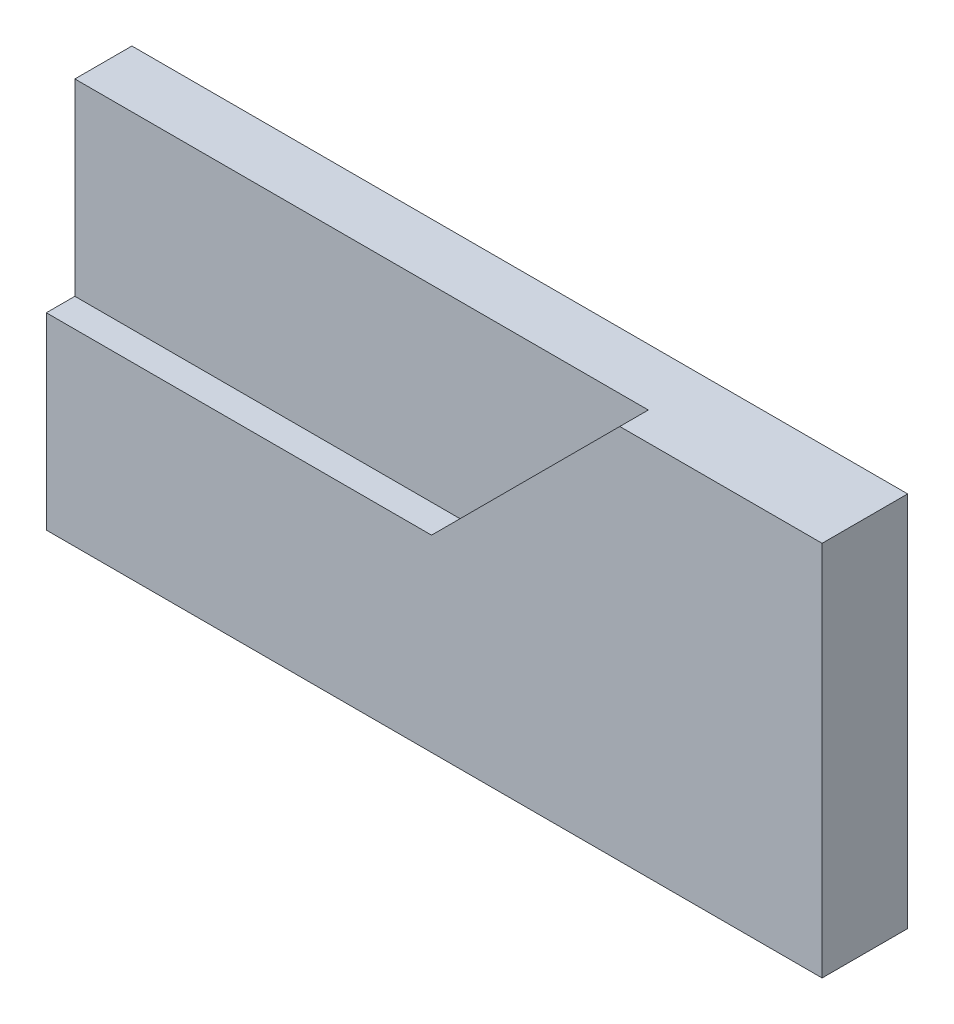
ISO-10303-21;
HEADER;
FILE_DESCRIPTION(('STEP AP214'),'2;1');
FILE_NAME('part.step','',(''),(''),'','','');
FILE_SCHEMA(('AUTOMOTIVE_DESIGN { 1 0 10303 214 1 1 1 1 }'));
ENDSEC;
DATA;
#1=APPLICATION_CONTEXT('core data for automotive mechanical design processes');
#2=APPLICATION_PROTOCOL_DEFINITION('international standard','automotive_design',2000,#1);
#3=PRODUCT_CONTEXT('',#1,'mechanical');
#4=PRODUCT('Part','Part','',(#3));
#5=PRODUCT_RELATED_PRODUCT_CATEGORY('part','',(#4));
#6=PRODUCT_DEFINITION_FORMATION('','',#4);
#7=PRODUCT_DEFINITION_CONTEXT('part definition',#1,'design');
#8=PRODUCT_DEFINITION('design','',#6,#7);
#9=PRODUCT_DEFINITION_SHAPE('','',#8);
#10=(LENGTH_UNIT() NAMED_UNIT(*) SI_UNIT(.MILLI.,.METRE.));
#11=(NAMED_UNIT(*) PLANE_ANGLE_UNIT() SI_UNIT($,.RADIAN.));
#12=(NAMED_UNIT(*) SI_UNIT($,.STERADIAN.) SOLID_ANGLE_UNIT());
#13=UNCERTAINTY_MEASURE_WITH_UNIT(LENGTH_MEASURE(1.E-05),#10,'distance_accuracy_value','');
#14=(GEOMETRIC_REPRESENTATION_CONTEXT(3) GLOBAL_UNCERTAINTY_ASSIGNED_CONTEXT((#13)) GLOBAL_UNIT_ASSIGNED_CONTEXT((#10,
#11,#12)) REPRESENTATION_CONTEXT('',''));
#15=CARTESIAN_POINT('',(0.,0.,0.));
#16=DIRECTION('',(0.,0.,1.));
#17=DIRECTION('',(1.,0.,0.));
#18=AXIS2_PLACEMENT_3D('',#15,#16,#17);
#19=CARTESIAN_POINT('',(20.1967772114493,31.337548907501,160.329908240271));
#20=DIRECTION('',(0.,-1.,0.));
#21=DIRECTION('',(0.,0.,-1.));
#22=AXIS2_PLACEMENT_3D('',#19,#20,#21);
#23=PLANE('',#22);
#24=DIRECTION('',(-1.,0.,0.));
#25=VECTOR('',#24,1.);
#26=CARTESIAN_POINT('',(16.6498722313358,31.337548907501,159.829908240271));
#27=LINE('',#26,#25);
#28=CARTESIAN_POINT('',(16.6498722313358,31.337548907501,159.829908240271));
#29=VERTEX_POINT('',#28);
#30=CARTESIAN_POINT('',(6.59677721144933,31.337548907501,159.829908240271));
#31=VERTEX_POINT('',#30);
#32=EDGE_CURVE('E113',#29,#31,#27,.T.);
#33=ORIENTED_EDGE('',*,*,#32,.F.);
#34=DIRECTION('',(0.,0.,1.));
#35=VECTOR('',#34,1.);
#36=CARTESIAN_POINT('',(16.6498722313358,31.337548907501,159.829908240271));
#37=LINE('',#36,#35);
#38=CARTESIAN_POINT('',(16.6498722313358,31.337548907501,160.329908240271));
#39=VERTEX_POINT('',#38);
#40=EDGE_CURVE('E120',#29,#39,#37,.T.);
#41=ORIENTED_EDGE('',*,*,#40,.T.);
#42=DIRECTION('',(-1.,0.,0.));
#43=VECTOR('',#42,1.);
#44=CARTESIAN_POINT('',(20.1967772114493,31.337548907501,160.329908240271));
#45=LINE('',#44,#43);
#46=CARTESIAN_POINT('',(20.1967772114493,31.337548907501,160.329908240271));
#47=VERTEX_POINT('',#46);
#48=EDGE_CURVE('E125',#47,#39,#45,.T.);
#49=ORIENTED_EDGE('',*,*,#48,.F.);
#50=DIRECTION('',(0.,0.,-1.));
#51=VECTOR('',#50,1.);
#52=CARTESIAN_POINT('',(20.1967772114493,31.337548907501,160.329908240271));
#53=LINE('',#52,#51);
#54=CARTESIAN_POINT('',(20.1967772114493,31.337548907501,158.829908240271));
#55=VERTEX_POINT('',#54);
#56=EDGE_CURVE('E131',#47,#55,#53,.T.);
#57=ORIENTED_EDGE('',*,*,#56,.T.);
#58=DIRECTION('',(-1.,0.,0.));
#59=VECTOR('',#58,1.);
#60=CARTESIAN_POINT('',(20.1967772114493,31.337548907501,158.829908240271));
#61=LINE('',#60,#59);
#62=CARTESIAN_POINT('',(6.59677721144933,31.337548907501,158.829908240271));
#63=VERTEX_POINT('',#62);
#64=EDGE_CURVE('E132',#55,#63,#61,.T.);
#65=ORIENTED_EDGE('',*,*,#64,.T.);
#66=DIRECTION('',(0.,0.,-1.));
#67=VECTOR('',#66,1.);
#68=CARTESIAN_POINT('',(6.59677721144933,31.337548907501,160.329908240271));
#69=LINE('',#68,#67);
#70=EDGE_CURVE('E11',#31,#63,#69,.T.);
#71=ORIENTED_EDGE('',*,*,#70,.F.);
#72=EDGE_LOOP('',(#33,#41,#49,#57,#65,#71));
#73=FACE_BOUND('',#72,.T.);
#74=ADVANCED_FACE('F35',(#73),#23,.F.);
#75=CARTESIAN_POINT('',(6.59677721144933,31.337548907501,160.329908240271));
#76=DIRECTION('',(1.,0.,0.));
#77=DIRECTION('',(0.,1.,0.));
#78=AXIS2_PLACEMENT_3D('',#75,#76,#77);
#79=PLANE('',#78);
#80=DIRECTION('',(0.,-1.,0.));
#81=VECTOR('',#80,1.);
#82=CARTESIAN_POINT('',(6.59677721144933,31.337548907501,160.329908240271));
#83=LINE('',#82,#81);
#84=CARTESIAN_POINT('',(6.59677721144933,28.037548907501,160.329908240271));
#85=VERTEX_POINT('',#84);
#86=CARTESIAN_POINT('',(6.59677721144933,24.737548907501,160.329908240271));
#87=VERTEX_POINT('',#86);
#88=EDGE_CURVE('E81',#85,#87,#83,.T.);
#89=ORIENTED_EDGE('',*,*,#88,.F.);
#90=DIRECTION('',(0.,0.,1.));
#91=VECTOR('',#90,1.);
#92=CARTESIAN_POINT('',(6.59677721144933,28.037548907501,159.829908240271));
#93=LINE('',#92,#91);
#94=CARTESIAN_POINT('',(6.59677721144933,28.037548907501,159.829908240271));
#95=VERTEX_POINT('',#94);
#96=EDGE_CURVE('E49',#95,#85,#93,.T.);
#97=ORIENTED_EDGE('',*,*,#96,.F.);
#98=DIRECTION('',(0.,-1.,0.));
#99=VECTOR('',#98,1.);
#100=CARTESIAN_POINT('',(6.59677721144933,31.337548907501,159.829908240271));
#101=LINE('',#100,#99);
#102=EDGE_CURVE('E108',#31,#95,#101,.T.);
#103=ORIENTED_EDGE('',*,*,#102,.F.);
#104=ORIENTED_EDGE('',*,*,#70,.T.);
#105=DIRECTION('',(0.,-1.,0.));
#106=VECTOR('',#105,1.);
#107=CARTESIAN_POINT('',(6.59677721144933,31.337548907501,158.829908240271));
#108=LINE('',#107,#106);
#109=CARTESIAN_POINT('',(6.59677721144933,24.737548907501,158.829908240271));
#110=VERTEX_POINT('',#109);
#111=EDGE_CURVE('E135',#63,#110,#108,.T.);
#112=ORIENTED_EDGE('',*,*,#111,.T.);
#113=DIRECTION('',(0.,0.,-1.));
#114=VECTOR('',#113,1.);
#115=CARTESIAN_POINT('',(6.59677721144933,24.737548907501,160.329908240271));
#116=LINE('',#115,#114);
#117=EDGE_CURVE('E42',#87,#110,#116,.T.);
#118=ORIENTED_EDGE('',*,*,#117,.F.);
#119=EDGE_LOOP('',(#89,#97,#103,#104,#112,#118));
#120=FACE_BOUND('',#119,.T.);
#121=ADVANCED_FACE('F118',(#120),#79,.F.);
#122=CARTESIAN_POINT('',(6.59677721144933,24.737548907501,160.329908240271));
#123=DIRECTION('',(0.,1.,0.));
#124=DIRECTION('',(0.,0.,1.));
#125=AXIS2_PLACEMENT_3D('',#122,#123,#124);
#126=PLANE('',#125);
#127=DIRECTION('',(1.,0.,0.));
#128=VECTOR('',#127,1.);
#129=CARTESIAN_POINT('',(6.59677721144933,24.737548907501,158.829908240271));
#130=LINE('',#129,#128);
#131=CARTESIAN_POINT('',(20.1967772114493,24.737548907501,158.829908240271));
#132=VERTEX_POINT('',#131);
#133=EDGE_CURVE('E137',#110,#132,#130,.T.);
#134=ORIENTED_EDGE('',*,*,#133,.T.);
#135=DIRECTION('',(0.,0.,-1.));
#136=VECTOR('',#135,1.);
#137=CARTESIAN_POINT('',(20.1967772114493,24.737548907501,160.329908240271));
#138=LINE('',#137,#136);
#139=CARTESIAN_POINT('',(20.1967772114493,24.737548907501,160.329908240271));
#140=VERTEX_POINT('',#139);
#141=EDGE_CURVE('E141',#140,#132,#138,.T.);
#142=ORIENTED_EDGE('',*,*,#141,.F.);
#143=DIRECTION('',(1.,0.,0.));
#144=VECTOR('',#143,1.);
#145=CARTESIAN_POINT('',(6.59677721144933,24.737548907501,160.329908240271));
#146=LINE('',#145,#144);
#147=EDGE_CURVE('E128',#87,#140,#146,.T.);
#148=ORIENTED_EDGE('',*,*,#147,.F.);
#149=ORIENTED_EDGE('',*,*,#117,.T.);
#150=EDGE_LOOP('',(#134,#142,#148,#149));
#151=FACE_BOUND('',#150,.T.);
#152=ADVANCED_FACE('F146',(#151),#126,.F.);
#153=CARTESIAN_POINT('',(20.1967772114493,24.737548907501,160.329908240271));
#154=DIRECTION('',(-1.,0.,0.));
#155=DIRECTION('',(0.,-1.,0.));
#156=AXIS2_PLACEMENT_3D('',#153,#154,#155);
#157=PLANE('',#156);
#158=DIRECTION('',(0.,1.,0.));
#159=VECTOR('',#158,1.);
#160=CARTESIAN_POINT('',(20.1967772114493,24.737548907501,158.829908240271));
#161=LINE('',#160,#159);
#162=EDGE_CURVE('E77',#132,#55,#161,.T.);
#163=ORIENTED_EDGE('',*,*,#162,.T.);
#164=ORIENTED_EDGE('',*,*,#56,.F.);
#165=DIRECTION('',(0.,1.,0.));
#166=VECTOR('',#165,1.);
#167=CARTESIAN_POINT('',(20.1967772114493,24.737548907501,160.329908240271));
#168=LINE('',#167,#166);
#169=EDGE_CURVE('E58',#140,#47,#168,.T.);
#170=ORIENTED_EDGE('',*,*,#169,.F.);
#171=ORIENTED_EDGE('',*,*,#141,.T.);
#172=EDGE_LOOP('',(#163,#164,#170,#171));
#173=FACE_BOUND('',#172,.T.);
#174=ADVANCED_FACE('F155',(#173),#157,.F.);
#175=CARTESIAN_POINT('',(0.,0.,160.329908240271));
#176=DIRECTION('',(0.,0.,1.));
#177=DIRECTION('',(1.,0.,0.));
#178=AXIS2_PLACEMENT_3D('',#175,#176,#177);
#179=PLANE('',#178);
#180=DIRECTION('',(0.707106781186547,0.707106781186548,0.));
#181=VECTOR('',#180,1.);
#182=CARTESIAN_POINT('',(13.3498722313358,28.037548907501,160.329908240271));
#183=LINE('',#182,#181);
#184=CARTESIAN_POINT('',(13.3498722313358,28.037548907501,160.329908240271));
#185=VERTEX_POINT('',#184);
#186=EDGE_CURVE('E116',#185,#39,#183,.T.);
#187=ORIENTED_EDGE('',*,*,#186,.F.);
#188=DIRECTION('',(1.,0.,0.));
#189=VECTOR('',#188,1.);
#190=CARTESIAN_POINT('',(6.59677721144933,28.037548907501,160.329908240271));
#191=LINE('',#190,#189);
#192=EDGE_CURVE('E225',#85,#185,#191,.T.);
#193=ORIENTED_EDGE('',*,*,#192,.F.);
#194=ORIENTED_EDGE('',*,*,#88,.T.);
#195=ORIENTED_EDGE('',*,*,#147,.T.);
#196=ORIENTED_EDGE('',*,*,#169,.T.);
#197=ORIENTED_EDGE('',*,*,#48,.T.);
#198=EDGE_LOOP('',(#187,#193,#194,#195,#196,#197));
#199=FACE_BOUND('',#198,.T.);
#200=ADVANCED_FACE('F157',(#199),#179,.T.);
#201=CARTESIAN_POINT('',(0.,0.,158.829908240271));
#202=DIRECTION('',(0.,0.,1.));
#203=DIRECTION('',(1.,0.,0.));
#204=AXIS2_PLACEMENT_3D('',#201,#202,#203);
#205=PLANE('',#204);
#206=ORIENTED_EDGE('',*,*,#64,.F.);
#207=ORIENTED_EDGE('',*,*,#162,.F.);
#208=ORIENTED_EDGE('',*,*,#133,.F.);
#209=ORIENTED_EDGE('',*,*,#111,.F.);
#210=EDGE_LOOP('',(#206,#207,#208,#209));
#211=FACE_BOUND('',#210,.T.);
#212=ADVANCED_FACE('F151',(#211),#205,.F.);
#213=CARTESIAN_POINT('',(13.3498722313358,28.037548907501,159.829908240271));
#214=DIRECTION('',(0.707106781186548,-0.707106781186547,0.));
#215=DIRECTION('',(0.707106781186547,0.707106781186548,0.));
#216=AXIS2_PLACEMENT_3D('',#213,#214,#215);
#217=PLANE('',#216);
#218=ORIENTED_EDGE('',*,*,#186,.T.);
#219=ORIENTED_EDGE('',*,*,#40,.F.);
#220=DIRECTION('',(0.707106781186547,0.707106781186548,0.));
#221=VECTOR('',#220,1.);
#222=CARTESIAN_POINT('',(13.3498722313358,28.037548907501,159.829908240271));
#223=LINE('',#222,#221);
#224=CARTESIAN_POINT('',(13.3498722313358,28.037548907501,159.829908240271));
#225=VERTEX_POINT('',#224);
#226=EDGE_CURVE('E107',#225,#29,#223,.T.);
#227=ORIENTED_EDGE('',*,*,#226,.F.);
#228=DIRECTION('',(0.,0.,1.));
#229=VECTOR('',#228,1.);
#230=CARTESIAN_POINT('',(13.3498722313358,28.037548907501,159.829908240271));
#231=LINE('',#230,#229);
#232=EDGE_CURVE('E103',#225,#185,#231,.T.);
#233=ORIENTED_EDGE('',*,*,#232,.T.);
#234=EDGE_LOOP('',(#218,#219,#227,#233));
#235=FACE_BOUND('',#234,.T.);
#236=ADVANCED_FACE('F195',(#235),#217,.F.);
#237=CARTESIAN_POINT('',(6.59677721144933,28.037548907501,159.829908240271));
#238=DIRECTION('',(0.,-1.,0.));
#239=DIRECTION('',(0.,0.,-1.));
#240=AXIS2_PLACEMENT_3D('',#237,#238,#239);
#241=PLANE('',#240);
#242=ORIENTED_EDGE('',*,*,#192,.T.);
#243=ORIENTED_EDGE('',*,*,#232,.F.);
#244=DIRECTION('',(1.,0.,0.));
#245=VECTOR('',#244,1.);
#246=CARTESIAN_POINT('',(6.59677721144933,28.037548907501,159.829908240271));
#247=LINE('',#246,#245);
#248=EDGE_CURVE('E100',#95,#225,#247,.T.);
#249=ORIENTED_EDGE('',*,*,#248,.F.);
#250=ORIENTED_EDGE('',*,*,#96,.T.);
#251=EDGE_LOOP('',(#242,#243,#249,#250));
#252=FACE_BOUND('',#251,.T.);
#253=ADVANCED_FACE('F102',(#252),#241,.F.);
#254=CARTESIAN_POINT('',(0.,0.,159.829908240271));
#255=DIRECTION('',(0.,0.,1.));
#256=DIRECTION('',(1.,0.,0.));
#257=AXIS2_PLACEMENT_3D('',#254,#255,#256);
#258=PLANE('',#257);
#259=ORIENTED_EDGE('',*,*,#102,.T.);
#260=ORIENTED_EDGE('',*,*,#248,.T.);
#261=ORIENTED_EDGE('',*,*,#226,.T.);
#262=ORIENTED_EDGE('',*,*,#32,.T.);
#263=EDGE_LOOP('',(#259,#260,#261,#262));
#264=FACE_BOUND('',#263,.T.);
#265=ADVANCED_FACE('F111',(#264),#258,.T.);
#266=CLOSED_SHELL('',(#74,#121,#152,#174,#200,#212,#236,#253,#265));
#267=MANIFOLD_SOLID_BREP('B2',#266);
#268=ADVANCED_BREP_SHAPE_REPRESENTATION('',(#18,#267),#14);
#269=SHAPE_DEFINITION_REPRESENTATION(#9,#268);
ENDSEC;
END-ISO-10303-21;
